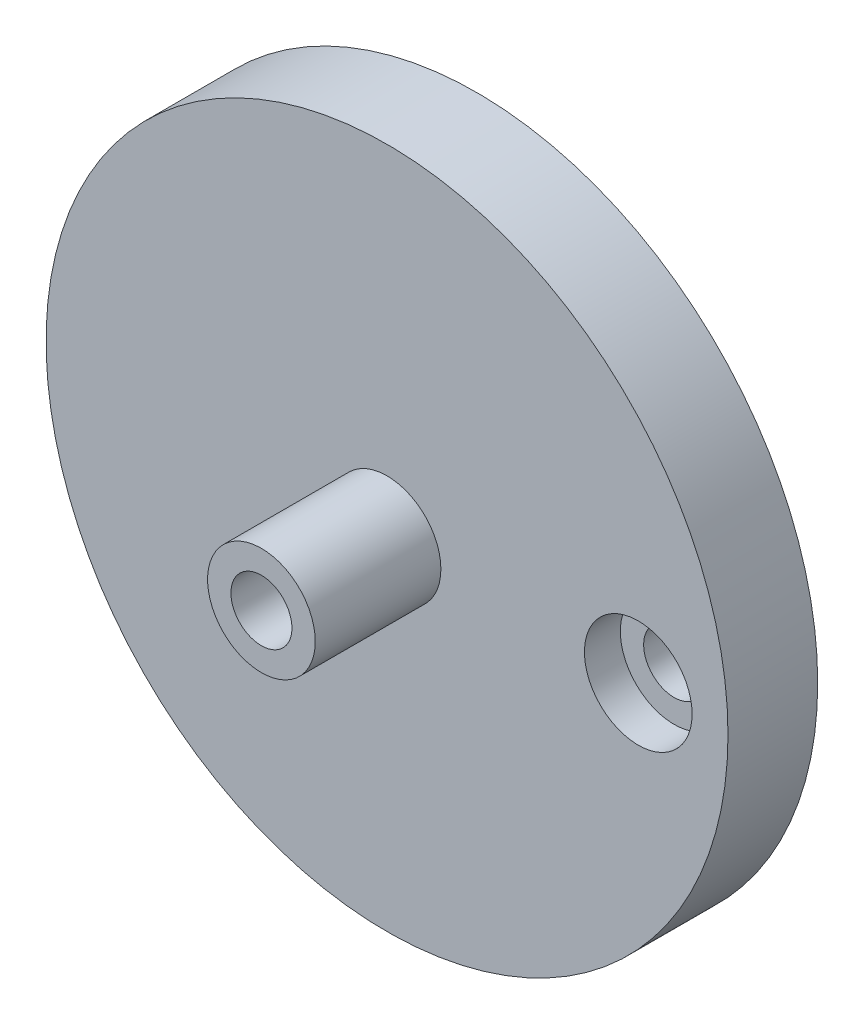
ISO-10303-21;
HEADER;
FILE_DESCRIPTION(('STEP AP214'),'2;1');
FILE_NAME('part.step','',(''),(''),'','','');
FILE_SCHEMA(('AUTOMOTIVE_DESIGN { 1 0 10303 214 1 1 1 1 }'));
ENDSEC;
DATA;
#1=APPLICATION_CONTEXT('core data for automotive mechanical design processes');
#2=APPLICATION_PROTOCOL_DEFINITION('international standard','automotive_design',2000,#1);
#3=PRODUCT_CONTEXT('',#1,'mechanical');
#4=PRODUCT('Part','Part','',(#3));
#5=PRODUCT_RELATED_PRODUCT_CATEGORY('part','',(#4));
#6=PRODUCT_DEFINITION_FORMATION('','',#4);
#7=PRODUCT_DEFINITION_CONTEXT('part definition',#1,'design');
#8=PRODUCT_DEFINITION('design','',#6,#7);
#9=PRODUCT_DEFINITION_SHAPE('','',#8);
#10=(LENGTH_UNIT() NAMED_UNIT(*) SI_UNIT(.MILLI.,.METRE.));
#11=(NAMED_UNIT(*) PLANE_ANGLE_UNIT() SI_UNIT($,.RADIAN.));
#12=(NAMED_UNIT(*) SI_UNIT($,.STERADIAN.) SOLID_ANGLE_UNIT());
#13=UNCERTAINTY_MEASURE_WITH_UNIT(LENGTH_MEASURE(1.E-05),#10,'distance_accuracy_value','');
#14=(GEOMETRIC_REPRESENTATION_CONTEXT(3) GLOBAL_UNCERTAINTY_ASSIGNED_CONTEXT((#13)) GLOBAL_UNIT_ASSIGNED_CONTEXT((#10,
#11,#12)) REPRESENTATION_CONTEXT('',''));
#15=CARTESIAN_POINT('',(0.,0.,0.));
#16=DIRECTION('',(0.,0.,1.));
#17=DIRECTION('',(1.,0.,0.));
#18=AXIS2_PLACEMENT_3D('',#15,#16,#17);
#19=CARTESIAN_POINT('',(14.,0.,12.));
#20=DIRECTION('',(0.,0.,-1.));
#21=DIRECTION('',(-1.,0.,0.));
#22=AXIS2_PLACEMENT_3D('',#19,#20,#21);
#23=CYLINDRICAL_SURFACE('',#22,1.7);
#24=CARTESIAN_POINT('',(14.,0.,0.));
#25=DIRECTION('',(0.,0.,1.));
#26=DIRECTION('',(1.,0.,0.));
#27=AXIS2_PLACEMENT_3D('',#24,#25,#26);
#28=CIRCLE('',#27,1.7);
#29=CARTESIAN_POINT('',(15.7,0.,0.));
#30=VERTEX_POINT('',#29);
#31=EDGE_CURVE('E72',#30,#30,#28,.T.);
#32=ORIENTED_EDGE('',*,*,#31,.F.);
#33=EDGE_LOOP('',(#32));
#34=FACE_BOUND('',#33,.T.);
#35=CARTESIAN_POINT('',(14.,0.,3.));
#36=DIRECTION('',(0.,0.,1.));
#37=DIRECTION('',(1.,0.,0.));
#38=AXIS2_PLACEMENT_3D('',#35,#36,#37);
#39=CIRCLE('',#38,1.7);
#40=CARTESIAN_POINT('',(15.7,0.,3.));
#41=VERTEX_POINT('',#40);
#42=EDGE_CURVE('E47',#41,#41,#39,.F.);
#43=ORIENTED_EDGE('',*,*,#42,.F.);
#44=EDGE_LOOP('',(#43));
#45=FACE_BOUND('',#44,.T.);
#46=ADVANCED_FACE('F43',(#34,#45),#23,.F.);
#47=CARTESIAN_POINT('',(0.,0.,0.));
#48=DIRECTION('',(0.,0.,1.));
#49=DIRECTION('',(1.,0.,0.));
#50=AXIS2_PLACEMENT_3D('',#47,#48,#49);
#51=CYLINDRICAL_SURFACE('',#50,1.7);
#52=CARTESIAN_POINT('',(0.,0.,12.));
#53=DIRECTION('',(0.,0.,1.));
#54=DIRECTION('',(1.,0.,0.));
#55=AXIS2_PLACEMENT_3D('',#52,#53,#54);
#56=CIRCLE('',#55,1.7);
#57=CARTESIAN_POINT('',(1.7,0.,12.));
#58=VERTEX_POINT('',#57);
#59=EDGE_CURVE('E70',#58,#58,#56,.T.);
#60=ORIENTED_EDGE('',*,*,#59,.T.);
#61=EDGE_LOOP('',(#60));
#62=FACE_BOUND('',#61,.T.);
#63=CARTESIAN_POINT('',(0.,0.,2.));
#64=DIRECTION('',(0.,0.,-1.));
#65=DIRECTION('',(-1.,0.,0.));
#66=AXIS2_PLACEMENT_3D('',#63,#64,#65);
#67=CIRCLE('',#66,1.7);
#68=CARTESIAN_POINT('',(-1.7,0.,2.));
#69=VERTEX_POINT('',#68);
#70=EDGE_CURVE('E67',#69,#69,#67,.F.);
#71=ORIENTED_EDGE('',*,*,#70,.F.);
#72=EDGE_LOOP('',(#71));
#73=FACE_BOUND('',#72,.T.);
#74=ADVANCED_FACE('F123',(#62,#73),#51,.F.);
#75=CARTESIAN_POINT('',(0.,0.,5.));
#76=DIRECTION('',(0.,0.,-1.));
#77=DIRECTION('',(-1.,0.,0.));
#78=AXIS2_PLACEMENT_3D('',#75,#76,#77);
#79=CYLINDRICAL_SURFACE('',#78,19.);
#80=CARTESIAN_POINT('',(0.,0.,5.));
#81=DIRECTION('',(0.,0.,1.));
#82=DIRECTION('',(1.,0.,0.));
#83=AXIS2_PLACEMENT_3D('',#80,#81,#82);
#84=CIRCLE('',#83,19.);
#85=CARTESIAN_POINT('',(19.,0.,5.));
#86=VERTEX_POINT('',#85);
#87=EDGE_CURVE('E52',#86,#86,#84,.T.);
#88=ORIENTED_EDGE('',*,*,#87,.F.);
#89=EDGE_LOOP('',(#88));
#90=FACE_BOUND('',#89,.T.);
#91=CARTESIAN_POINT('',(0.,0.,0.));
#92=DIRECTION('',(0.,0.,1.));
#93=DIRECTION('',(1.,0.,0.));
#94=AXIS2_PLACEMENT_3D('',#91,#92,#93);
#95=CIRCLE('',#94,19.);
#96=CARTESIAN_POINT('',(19.,0.,0.));
#97=VERTEX_POINT('',#96);
#98=EDGE_CURVE('E58',#97,#97,#95,.T.);
#99=ORIENTED_EDGE('',*,*,#98,.T.);
#100=EDGE_LOOP('',(#99));
#101=FACE_BOUND('',#100,.T.);
#102=ADVANCED_FACE('F45',(#90,#101),#79,.T.);
#103=CARTESIAN_POINT('',(0.,0.,5.));
#104=DIRECTION('',(0.,0.,1.));
#105=DIRECTION('',(1.,0.,0.));
#106=AXIS2_PLACEMENT_3D('',#103,#104,#105);
#107=PLANE('',#106);
#108=CARTESIAN_POINT('',(14.,0.,5.));
#109=DIRECTION('',(0.,0.,1.));
#110=DIRECTION('',(1.,0.,0.));
#111=AXIS2_PLACEMENT_3D('',#108,#109,#110);
#112=CIRCLE('',#111,3.);
#113=CARTESIAN_POINT('',(17.,0.,5.));
#114=VERTEX_POINT('',#113);
#115=EDGE_CURVE('E88',#114,#114,#112,.T.);
#116=ORIENTED_EDGE('',*,*,#115,.F.);
#117=EDGE_LOOP('',(#116));
#118=FACE_BOUND('',#117,.T.);
#119=CARTESIAN_POINT('',(0.,0.,5.));
#120=DIRECTION('',(0.,0.,1.));
#121=DIRECTION('',(1.,0.,0.));
#122=AXIS2_PLACEMENT_3D('',#119,#120,#121);
#123=CIRCLE('',#122,3.);
#124=CARTESIAN_POINT('',(3.,0.,5.));
#125=VERTEX_POINT('',#124);
#126=EDGE_CURVE('E10',#125,#125,#123,.T.);
#127=ORIENTED_EDGE('',*,*,#126,.F.);
#128=EDGE_LOOP('',(#127));
#129=FACE_BOUND('',#128,.T.);
#130=ORIENTED_EDGE('',*,*,#87,.T.);
#131=EDGE_LOOP('',(#130));
#132=FACE_BOUND('',#131,.T.);
#133=ADVANCED_FACE('F120',(#118,#129,#132),#107,.T.);
#134=CARTESIAN_POINT('',(0.,0.,0.));
#135=DIRECTION('',(0.,0.,1.));
#136=DIRECTION('',(1.,0.,0.));
#137=AXIS2_PLACEMENT_3D('',#134,#135,#136);
#138=PLANE('',#137);
#139=ORIENTED_EDGE('',*,*,#31,.T.);
#140=EDGE_LOOP('',(#139));
#141=FACE_BOUND('',#140,.T.);
#142=CARTESIAN_POINT('',(0.,0.,0.));
#143=DIRECTION('',(0.,0.,-1.));
#144=DIRECTION('',(-1.,0.,0.));
#145=AXIS2_PLACEMENT_3D('',#142,#143,#144);
#146=CIRCLE('',#145,3.);
#147=CARTESIAN_POINT('',(-3.,0.,0.));
#148=VERTEX_POINT('',#147);
#149=EDGE_CURVE('E75',#148,#148,#146,.T.);
#150=ORIENTED_EDGE('',*,*,#149,.F.);
#151=EDGE_LOOP('',(#150));
#152=FACE_BOUND('',#151,.T.);
#153=ORIENTED_EDGE('',*,*,#98,.F.);
#154=EDGE_LOOP('',(#153));
#155=FACE_BOUND('',#154,.T.);
#156=ADVANCED_FACE('F110',(#141,#152,#155),#138,.F.);
#157=CARTESIAN_POINT('',(0.,0.,12.));
#158=DIRECTION('',(0.,0.,-1.));
#159=DIRECTION('',(-1.,0.,0.));
#160=AXIS2_PLACEMENT_3D('',#157,#158,#159);
#161=CYLINDRICAL_SURFACE('',#160,3.);
#162=CARTESIAN_POINT('',(0.,0.,12.));
#163=DIRECTION('',(0.,0.,1.));
#164=DIRECTION('',(1.,0.,0.));
#165=AXIS2_PLACEMENT_3D('',#162,#163,#164);
#166=CIRCLE('',#165,3.);
#167=CARTESIAN_POINT('',(3.,0.,12.));
#168=VERTEX_POINT('',#167);
#169=EDGE_CURVE('E61',#168,#168,#166,.T.);
#170=ORIENTED_EDGE('',*,*,#169,.F.);
#171=EDGE_LOOP('',(#170));
#172=FACE_BOUND('',#171,.T.);
#173=ORIENTED_EDGE('',*,*,#126,.T.);
#174=EDGE_LOOP('',(#173));
#175=FACE_BOUND('',#174,.T.);
#176=ADVANCED_FACE('F108',(#172,#175),#161,.T.);
#177=CARTESIAN_POINT('',(0.,0.,12.));
#178=DIRECTION('',(0.,0.,1.));
#179=DIRECTION('',(1.,0.,0.));
#180=AXIS2_PLACEMENT_3D('',#177,#178,#179);
#181=PLANE('',#180);
#182=ORIENTED_EDGE('',*,*,#59,.F.);
#183=EDGE_LOOP('',(#182));
#184=FACE_BOUND('',#183,.T.);
#185=ORIENTED_EDGE('',*,*,#169,.T.);
#186=EDGE_LOOP('',(#185));
#187=FACE_BOUND('',#186,.T.);
#188=ADVANCED_FACE('F106',(#184,#187),#181,.T.);
#189=CARTESIAN_POINT('',(0.,0.,2.));
#190=DIRECTION('',(0.,0.,-1.));
#191=DIRECTION('',(-1.,0.,0.));
#192=AXIS2_PLACEMENT_3D('',#189,#190,#191);
#193=PLANE('',#192);
#194=CARTESIAN_POINT('',(0.,0.,2.));
#195=DIRECTION('',(0.,0.,-1.));
#196=DIRECTION('',(-1.,0.,0.));
#197=AXIS2_PLACEMENT_3D('',#194,#195,#196);
#198=CIRCLE('',#197,3.);
#199=CARTESIAN_POINT('',(-3.,0.,2.));
#200=VERTEX_POINT('',#199);
#201=EDGE_CURVE('E71',#200,#200,#198,.T.);
#202=ORIENTED_EDGE('',*,*,#201,.T.);
#203=EDGE_LOOP('',(#202));
#204=FACE_BOUND('',#203,.T.);
#205=ORIENTED_EDGE('',*,*,#70,.T.);
#206=EDGE_LOOP('',(#205));
#207=FACE_BOUND('',#206,.T.);
#208=ADVANCED_FACE('F116',(#204,#207),#193,.T.);
#209=CARTESIAN_POINT('',(0.,0.,2.));
#210=DIRECTION('',(0.,0.,-1.));
#211=DIRECTION('',(-1.,0.,0.));
#212=AXIS2_PLACEMENT_3D('',#209,#210,#211);
#213=CYLINDRICAL_SURFACE('',#212,3.);
#214=ORIENTED_EDGE('',*,*,#201,.F.);
#215=EDGE_LOOP('',(#214));
#216=FACE_BOUND('',#215,.T.);
#217=ORIENTED_EDGE('',*,*,#149,.T.);
#218=EDGE_LOOP('',(#217));
#219=FACE_BOUND('',#218,.T.);
#220=ADVANCED_FACE('F138',(#216,#219),#213,.F.);
#221=CARTESIAN_POINT('',(14.,0.,3.));
#222=DIRECTION('',(0.,0.,1.));
#223=DIRECTION('',(1.,0.,0.));
#224=AXIS2_PLACEMENT_3D('',#221,#222,#223);
#225=PLANE('',#224);
#226=CARTESIAN_POINT('',(14.,0.,3.));
#227=DIRECTION('',(0.,0.,1.));
#228=DIRECTION('',(1.,0.,0.));
#229=AXIS2_PLACEMENT_3D('',#226,#227,#228);
#230=CIRCLE('',#229,3.);
#231=CARTESIAN_POINT('',(17.,0.,3.));
#232=VERTEX_POINT('',#231);
#233=EDGE_CURVE('E83',#232,#232,#230,.T.);
#234=ORIENTED_EDGE('',*,*,#233,.T.);
#235=EDGE_LOOP('',(#234));
#236=FACE_BOUND('',#235,.T.);
#237=ORIENTED_EDGE('',*,*,#42,.T.);
#238=EDGE_LOOP('',(#237));
#239=FACE_BOUND('',#238,.T.);
#240=ADVANCED_FACE('F141',(#236,#239),#225,.T.);
#241=CARTESIAN_POINT('',(14.,0.,3.));
#242=DIRECTION('',(0.,0.,1.));
#243=DIRECTION('',(1.,0.,0.));
#244=AXIS2_PLACEMENT_3D('',#241,#242,#243);
#245=CYLINDRICAL_SURFACE('',#244,3.);
#246=ORIENTED_EDGE('',*,*,#233,.F.);
#247=EDGE_LOOP('',(#246));
#248=FACE_BOUND('',#247,.T.);
#249=ORIENTED_EDGE('',*,*,#115,.T.);
#250=EDGE_LOOP('',(#249));
#251=FACE_BOUND('',#250,.T.);
#252=ADVANCED_FACE('F134',(#248,#251),#245,.F.);
#253=CLOSED_SHELL('',(#46,#74,#102,#133,#156,#176,#188,#208,#220,#240,#252));
#254=MANIFOLD_SOLID_BREP('B2',#253);
#255=ADVANCED_BREP_SHAPE_REPRESENTATION('',(#18,#254),#14);
#256=SHAPE_DEFINITION_REPRESENTATION(#9,#255);
ENDSEC;
END-ISO-10303-21;
